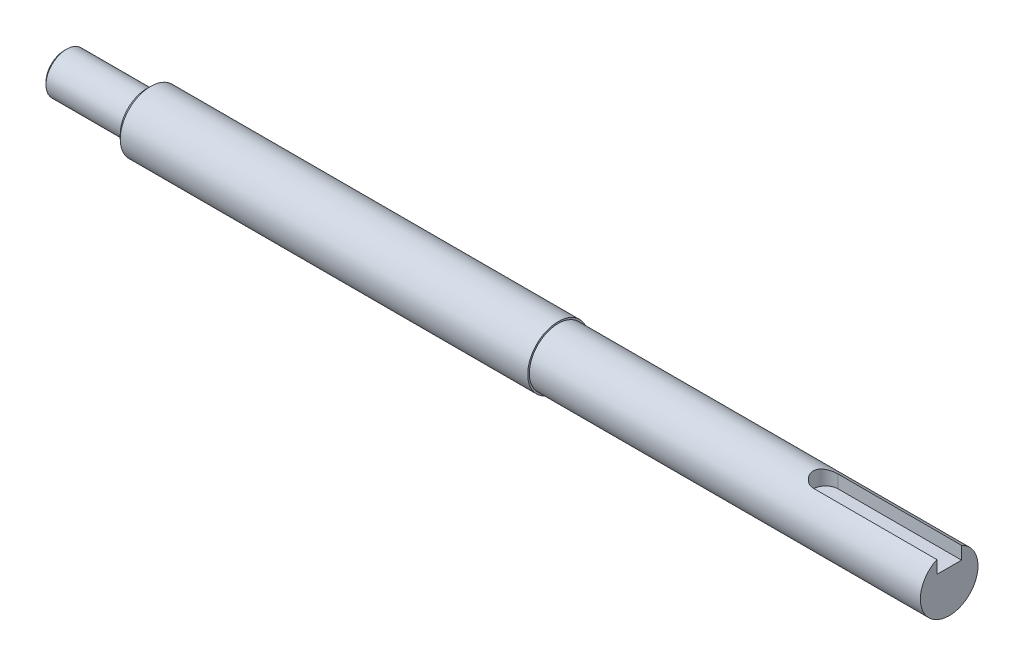
ISO-10303-21;
HEADER;
FILE_DESCRIPTION(('STEP AP214'),'2;1');
FILE_NAME('part.step','',(''),(''),'','','');
FILE_SCHEMA(('AUTOMOTIVE_DESIGN { 1 0 10303 214 1 1 1 1 }'));
ENDSEC;
DATA;
#1=APPLICATION_CONTEXT('core data for automotive mechanical design processes');
#2=APPLICATION_PROTOCOL_DEFINITION('international standard','automotive_design',2000,#1);
#3=PRODUCT_CONTEXT('',#1,'mechanical');
#4=PRODUCT('Part','Part','',(#3));
#5=PRODUCT_RELATED_PRODUCT_CATEGORY('part','',(#4));
#6=PRODUCT_DEFINITION_FORMATION('','',#4);
#7=PRODUCT_DEFINITION_CONTEXT('part definition',#1,'design');
#8=PRODUCT_DEFINITION('design','',#6,#7);
#9=PRODUCT_DEFINITION_SHAPE('','',#8);
#10=(LENGTH_UNIT() NAMED_UNIT(*) SI_UNIT(.MILLI.,.METRE.));
#11=(NAMED_UNIT(*) PLANE_ANGLE_UNIT() SI_UNIT($,.RADIAN.));
#12=(NAMED_UNIT(*) SI_UNIT($,.STERADIAN.) SOLID_ANGLE_UNIT());
#13=UNCERTAINTY_MEASURE_WITH_UNIT(LENGTH_MEASURE(1.E-05),#10,'distance_accuracy_value','');
#14=(GEOMETRIC_REPRESENTATION_CONTEXT(3) GLOBAL_UNCERTAINTY_ASSIGNED_CONTEXT((#13)) GLOBAL_UNIT_ASSIGNED_CONTEXT((#10,
#11,#12)) REPRESENTATION_CONTEXT('',''));
#15=CARTESIAN_POINT('',(0.,0.,0.));
#16=DIRECTION('',(0.,0.,1.));
#17=DIRECTION('',(1.,0.,0.));
#18=AXIS2_PLACEMENT_3D('',#15,#16,#17);
#19=CARTESIAN_POINT('',(215.,0.,0.));
#20=DIRECTION('',(1.,0.,0.));
#21=DIRECTION('',(0.,0.,-1.));
#22=AXIS2_PLACEMENT_3D('',#19,#20,#21);
#23=CYLINDRICAL_SURFACE('',#22,6.99999999999999);
#24=CARTESIAN_POINT('',(120.,0.,0.));
#25=DIRECTION('',(1.,0.,0.));
#26=DIRECTION('',(0.,0.,-1.));
#27=AXIS2_PLACEMENT_3D('',#24,#25,#26);
#28=CIRCLE('',#27,6.99999999999999);
#29=CARTESIAN_POINT('',(120.,0.,-6.99999999999999));
#30=VERTEX_POINT('',#29);
#31=EDGE_CURVE('E139',#30,#30,#28,.T.);
#32=ORIENTED_EDGE('',*,*,#31,.T.);
#33=EDGE_LOOP('',(#32));
#34=FACE_BOUND('',#33,.T.);
#35=CARTESIAN_POINT('',(215.,0.,0.));
#36=DIRECTION('',(1.,0.,0.));
#37=DIRECTION('',(0.,0.,-1.));
#38=AXIS2_PLACEMENT_3D('',#35,#36,#37);
#39=CIRCLE('',#38,6.99999999999999);
#40=CARTESIAN_POINT('',(215.,6.32455532033675,2.99999999999999));
#41=VERTEX_POINT('',#40);
#42=CARTESIAN_POINT('',(215.,6.32455532033674,-3.00000000000001));
#43=VERTEX_POINT('',#42);
#44=EDGE_CURVE('E135',#41,#43,#39,.T.);
#45=ORIENTED_EDGE('',*,*,#44,.F.);
#46=DIRECTION('',(1.,0.,0.));
#47=VECTOR('',#46,1.);
#48=CARTESIAN_POINT('',(215.,6.32455532033675,2.99999999999999));
#49=LINE('',#48,#47);
#50=CARTESIAN_POINT('',(185.,6.32455532033675,2.99999999999999));
#51=VERTEX_POINT('',#50);
#52=EDGE_CURVE('E75',#41,#51,#49,.F.);
#53=ORIENTED_EDGE('',*,*,#52,.T.);
#54=CARTESIAN_POINT('',(185.,6.32455532033675,2.99999999999999));
#55=CARTESIAN_POINT('',(184.919849098455,6.32453705769519,3.00001254306736));
#56=CARTESIAN_POINT('',(184.839708175892,6.32607849540028,2.99678828367235));
#57=CARTESIAN_POINT('',(184.680085813293,6.33214404225042,2.9839643617539));
#58=CARTESIAN_POINT('',(184.600604099698,6.33666684428159,2.97436749314781));
#59=CARTESIAN_POINT('',(184.443215537221,6.34853244046131,2.9489524550049));
#60=CARTESIAN_POINT('',(184.365303296234,6.35586273428948,2.93316185555731));
#61=CARTESIAN_POINT('',(184.211256812614,6.3730877774628,2.89554459420568));
#62=CARTESIAN_POINT('',(184.13512270218,6.38298271682504,2.87371748504272));
#63=CARTESIAN_POINT('',(183.91035282903,6.41603200490111,2.79955128780393));
#64=CARTESIAN_POINT('',(183.76499569635,6.44257971875666,2.73846921792857));
#65=CARTESIAN_POINT('',(183.486515772062,6.50169272050227,2.59499222380164));
#66=CARTESIAN_POINT('',(183.353406788418,6.53426467832252,2.51257363532669));
#67=CARTESIAN_POINT('',(183.094544955766,6.60411405312685,2.32302725293402));
#68=CARTESIAN_POINT('',(182.969694143716,6.64155588231651,2.21472548614638));
#69=CARTESIAN_POINT('',(182.739276817769,6.7155744306841,1.97896856528652));
#70=CARTESIAN_POINT('',(182.633714566743,6.75215095707453,1.85150918860015));
#71=CARTESIAN_POINT('',(182.44008134089,6.8223644642648,1.5737747831145));
#72=CARTESIAN_POINT('',(182.353050641411,6.8557859753075,1.42271495617816));
#73=CARTESIAN_POINT('',(182.206035417155,6.91387431646518,1.10640653485993));
#74=CARTESIAN_POINT('',(182.146038130262,6.93854527642641,0.941164679580412));
#75=CARTESIAN_POINT('',(182.058135397375,6.97517454962191,0.610765713747409));
#76=CARTESIAN_POINT('',(182.028654475699,6.98775425794011,0.446098082630154));
#77=CARTESIAN_POINT('',(181.997517319212,7.001049244749,0.113702417032886));
#78=CARTESIAN_POINT('',(181.995849600784,7.00176941984547,-0.0540243257525655));
#79=CARTESIAN_POINT('',(182.019590365481,6.99162028745114,-0.376269822044588));
#80=CARTESIAN_POINT('',(182.043264269312,6.98149340930556,-0.53094423690181));
#81=CARTESIAN_POINT('',(182.114024875319,6.95182170740074,-0.833874381657529));
#82=CARTESIAN_POINT('',(182.161112887015,6.93227635688086,-0.982129752043266));
#83=CARTESIAN_POINT('',(182.2779063711,6.88526707387883,-1.27075708852243));
#84=CARTESIAN_POINT('',(182.347946982619,6.85768652277446,-1.41097366608797));
#85=CARTESIAN_POINT('',(182.508315636137,6.79727719946514,-1.67803358062501));
#86=CARTESIAN_POINT('',(182.598651221775,6.76444647708388,-1.80487191908105));
#87=CARTESIAN_POINT('',(182.80480558241,6.69393989837268,-2.05154095832147));
#88=CARTESIAN_POINT('',(182.922014102894,6.65608528204453,-2.17016135987782));
#89=CARTESIAN_POINT('',(183.174677964392,6.58158115892304,-2.38661241389783));
#90=CARTESIAN_POINT('',(183.310143261004,6.54493232331543,-2.4844316477271));
#91=CARTESIAN_POINT('',(183.60189993554,6.47564598718051,-2.65993956976187));
#92=CARTESIAN_POINT('',(183.758776418496,6.44320707333587,-2.73674953348503));
#93=CARTESIAN_POINT('',(184.003142898673,6.40212784214385,-2.83088640162987));
#94=CARTESIAN_POINT('',(184.086080592205,6.38970056630823,-2.85874710711773));
#95=CARTESIAN_POINT('',(184.25442301807,6.36780421567578,-2.90719355697351));
#96=CARTESIAN_POINT('',(184.339826634162,6.35833382463913,-2.92778253884331));
#97=CARTESIAN_POINT('',(184.520345779541,6.34202643705266,-2.96296075241436));
#98=CARTESIAN_POINT('',(184.615632745322,6.33551128843582,-2.97682504322622));
#99=CARTESIAN_POINT('',(184.807274020579,6.32675693798107,-2.99535742107445));
#100=CARTESIAN_POINT('',(184.903628174531,6.32451712112742,-3.00002683081742));
#101=CARTESIAN_POINT('',(185.,6.32455532033674,-3.00000000000001));
#102=B_SPLINE_CURVE_WITH_KNOTS('',3,(#54,#55,#56,#57,#58,#59,#60,#61,#62,#63,#64,#65,#66,#67,
#68,#69,#70,#71,#72,#73,#74,#75,#76,#77,#78,#79,#80,#81,#82,#83,#84,#85,#86,#87,#88,#89,#90,#91,
#92,#93,#94,#95,#96,#97,#98,#99,#100,#101),.UNSPECIFIED.,.F.,.F.,(4,2,2,2,2,2,2,2,2,2,2,2,2,2,2,
2,2,2,2,2,2,2,2,4),(0.,0.240356519060135,0.480607729095725,0.719801431096838,0.959012860261086,
1.43637009492775,1.91425904933999,2.42044016106245,2.92673300647695,3.45654397418246,
3.98610456240994,4.48670712132503,4.98710298451016,5.45531455073318,5.92355230634702,
6.39895663828865,6.87453797112704,7.38526003695073,7.89626173993991,8.4261701281025,
8.69096435319374,8.95564053808947,9.24463173513523,9.53358135703768),.UNSPECIFIED.);
#103=CARTESIAN_POINT('',(185.,6.32455532033674,-3.00000000000001));
#104=VERTEX_POINT('',#103);
#105=EDGE_CURVE('E11',#51,#104,#102,.T.);
#106=ORIENTED_EDGE('',*,*,#105,.T.);
#107=DIRECTION('',(1.,0.,0.));
#108=VECTOR('',#107,1.);
#109=CARTESIAN_POINT('',(215.,6.32455532033674,-3.00000000000001));
#110=LINE('',#109,#108);
#111=EDGE_CURVE('E100',#104,#43,#110,.T.);
#112=ORIENTED_EDGE('',*,*,#111,.T.);
#113=EDGE_LOOP('',(#45,#53,#106,#112));
#114=FACE_BOUND('',#113,.T.);
#115=ADVANCED_FACE('F45',(#34,#114),#23,.T.);
#116=CARTESIAN_POINT('',(215.,0.,-6.99999999999999));
#117=DIRECTION('',(1.,0.,0.));
#118=DIRECTION('',(0.,0.,-1.));
#119=AXIS2_PLACEMENT_3D('',#116,#117,#118);
#120=PLANE('',#119);
#121=DIRECTION('',(0.,0.,1.));
#122=VECTOR('',#121,1.);
#123=CARTESIAN_POINT('',(215.,3.2,-6.99999999999999));
#124=LINE('',#123,#122);
#125=CARTESIAN_POINT('',(215.,3.2,-3.00000000000001));
#126=VERTEX_POINT('',#125);
#127=CARTESIAN_POINT('',(215.,3.2,2.99999999999999));
#128=VERTEX_POINT('',#127);
#129=EDGE_CURVE('E155',#126,#128,#124,.T.);
#130=ORIENTED_EDGE('',*,*,#129,.T.);
#131=DIRECTION('',(0.,1.,0.));
#132=VECTOR('',#131,1.);
#133=CARTESIAN_POINT('',(215.,0.,2.99999999999999));
#134=LINE('',#133,#132);
#135=EDGE_CURVE('E61',#128,#41,#134,.T.);
#136=ORIENTED_EDGE('',*,*,#135,.T.);
#137=ORIENTED_EDGE('',*,*,#44,.T.);
#138=DIRECTION('',(0.,-1.,0.));
#139=VECTOR('',#138,1.);
#140=CARTESIAN_POINT('',(215.,0.,-3.00000000000001));
#141=LINE('',#140,#139);
#142=EDGE_CURVE('E158',#43,#126,#141,.T.);
#143=ORIENTED_EDGE('',*,*,#142,.T.);
#144=EDGE_LOOP('',(#130,#136,#137,#143));
#145=FACE_BOUND('',#144,.T.);
#146=ADVANCED_FACE('F164',(#145),#120,.T.);
#147=CARTESIAN_POINT('',(20.,0.,-7.));
#148=DIRECTION('',(-1.,0.,0.));
#149=DIRECTION('',(0.,0.,1.));
#150=AXIS2_PLACEMENT_3D('',#147,#148,#149);
#151=PLANE('',#150);
#152=CARTESIAN_POINT('',(20.,0.,0.));
#153=DIRECTION('',(-1.,0.,0.));
#154=DIRECTION('',(0.,0.,1.));
#155=AXIS2_PLACEMENT_3D('',#152,#153,#154);
#156=CIRCLE('',#155,6.39999999999997);
#157=CARTESIAN_POINT('',(20.,0.,6.39999999999997));
#158=VERTEX_POINT('',#157);
#159=EDGE_CURVE('E151',#158,#158,#156,.T.);
#160=ORIENTED_EDGE('',*,*,#159,.T.);
#161=EDGE_LOOP('',(#160));
#162=FACE_BOUND('',#161,.T.);
#163=CARTESIAN_POINT('',(20.,0.,0.));
#164=DIRECTION('',(1.,0.,0.));
#165=DIRECTION('',(0.,0.,-1.));
#166=AXIS2_PLACEMENT_3D('',#163,#164,#165);
#167=CIRCLE('',#166,5.);
#168=CARTESIAN_POINT('',(20.,0.,-5.));
#169=VERTEX_POINT('',#168);
#170=EDGE_CURVE('E131',#169,#169,#167,.T.);
#171=ORIENTED_EDGE('',*,*,#170,.T.);
#172=EDGE_LOOP('',(#171));
#173=FACE_BOUND('',#172,.T.);
#174=ADVANCED_FACE('F181',(#162,#173),#151,.T.);
#175=CARTESIAN_POINT('',(215.,0.,0.));
#176=DIRECTION('',(1.,0.,0.));
#177=DIRECTION('',(0.,0.,-1.));
#178=AXIS2_PLACEMENT_3D('',#175,#176,#177);
#179=CYLINDRICAL_SURFACE('',#178,7.39999999999998);
#180=CARTESIAN_POINT('',(21.,0.,0.));
#181=DIRECTION('',(-1.,0.,0.));
#182=DIRECTION('',(0.,0.,1.));
#183=AXIS2_PLACEMENT_3D('',#180,#181,#182);
#184=CIRCLE('',#183,7.39999999999998);
#185=CARTESIAN_POINT('',(21.,0.,7.39999999999998));
#186=VERTEX_POINT('',#185);
#187=EDGE_CURVE('E147',#186,#186,#184,.F.);
#188=ORIENTED_EDGE('',*,*,#187,.T.);
#189=EDGE_LOOP('',(#188));
#190=FACE_BOUND('',#189,.T.);
#191=CARTESIAN_POINT('',(120.,0.,0.));
#192=DIRECTION('',(1.,0.,0.));
#193=DIRECTION('',(0.,0.,-1.));
#194=AXIS2_PLACEMENT_3D('',#191,#192,#193);
#195=CIRCLE('',#194,7.39999999999998);
#196=CARTESIAN_POINT('',(120.,0.,-7.39999999999998));
#197=VERTEX_POINT('',#196);
#198=EDGE_CURVE('E143',#197,#197,#195,.T.);
#199=ORIENTED_EDGE('',*,*,#198,.F.);
#200=EDGE_LOOP('',(#199));
#201=FACE_BOUND('',#200,.T.);
#202=ADVANCED_FACE('F190',(#190,#201),#179,.T.);
#203=CARTESIAN_POINT('',(120.,0.,-7.39999999999998));
#204=DIRECTION('',(1.,0.,0.));
#205=DIRECTION('',(0.,0.,-1.));
#206=AXIS2_PLACEMENT_3D('',#203,#204,#205);
#207=PLANE('',#206);
#208=ORIENTED_EDGE('',*,*,#198,.T.);
#209=EDGE_LOOP('',(#208));
#210=FACE_BOUND('',#209,.T.);
#211=ORIENTED_EDGE('',*,*,#31,.F.);
#212=EDGE_LOOP('',(#211));
#213=FACE_BOUND('',#212,.T.);
#214=ADVANCED_FACE('F186',(#210,#213),#207,.T.);
#215=CARTESIAN_POINT('',(0.,0.,0.));
#216=DIRECTION('',(1.,0.,0.));
#217=DIRECTION('',(0.,0.,-1.));
#218=AXIS2_PLACEMENT_3D('',#215,#216,#217);
#219=CYLINDRICAL_SURFACE('',#218,5.);
#220=ORIENTED_EDGE('',*,*,#170,.F.);
#221=EDGE_LOOP('',(#220));
#222=FACE_BOUND('',#221,.T.);
#223=CARTESIAN_POINT('',(0.554499999999998,0.,0.));
#224=DIRECTION('',(1.,0.,0.));
#225=DIRECTION('',(0.,0.,-1.));
#226=AXIS2_PLACEMENT_3D('',#223,#224,#225);
#227=CIRCLE('',#226,5.);
#228=CARTESIAN_POINT('',(0.554499999999998,0.,-5.));
#229=VERTEX_POINT('',#228);
#230=EDGE_CURVE('E123',#229,#229,#227,.T.);
#231=ORIENTED_EDGE('',*,*,#230,.T.);
#232=EDGE_LOOP('',(#231));
#233=FACE_BOUND('',#232,.T.);
#234=ADVANCED_FACE('F189',(#222,#233),#219,.T.);
#235=CARTESIAN_POINT('',(0.,0.,0.));
#236=DIRECTION('',(1.,0.,0.));
#237=DIRECTION('',(0.,0.,-1.));
#238=AXIS2_PLACEMENT_3D('',#235,#236,#237);
#239=CONICAL_SURFACE('',#238,4.4455,0.785398163397449);
#240=ORIENTED_EDGE('',*,*,#230,.F.);
#241=EDGE_LOOP('',(#240));
#242=FACE_BOUND('',#241,.T.);
#243=CARTESIAN_POINT('',(0.,0.,0.));
#244=DIRECTION('',(1.,0.,0.));
#245=DIRECTION('',(0.,0.,-1.));
#246=AXIS2_PLACEMENT_3D('',#243,#244,#245);
#247=CIRCLE('',#246,4.4455);
#248=CARTESIAN_POINT('',(0.,0.,-4.4455));
#249=VERTEX_POINT('',#248);
#250=EDGE_CURVE('E127',#249,#249,#247,.T.);
#251=ORIENTED_EDGE('',*,*,#250,.T.);
#252=EDGE_LOOP('',(#251));
#253=FACE_BOUND('',#252,.T.);
#254=ADVANCED_FACE('F199',(#242,#253),#239,.T.);
#255=CARTESIAN_POINT('',(0.,0.,0.));
#256=DIRECTION('',(-1.,0.,0.));
#257=DIRECTION('',(0.,0.,1.));
#258=AXIS2_PLACEMENT_3D('',#255,#256,#257);
#259=PLANE('',#258);
#260=ORIENTED_EDGE('',*,*,#250,.F.);
#261=EDGE_LOOP('',(#260));
#262=FACE_BOUND('',#261,.T.);
#263=ADVANCED_FACE('F197',(#262),#259,.T.);
#264=CARTESIAN_POINT('',(21.,0.,0.));
#265=DIRECTION('',(1.,0.,0.));
#266=DIRECTION('',(0.,0.,-1.));
#267=AXIS2_PLACEMENT_3D('',#264,#265,#266);
#268=CONICAL_SURFACE('',#267,7.39999999999998,0.785398163397455);
#269=ORIENTED_EDGE('',*,*,#159,.F.);
#270=EDGE_LOOP('',(#269));
#271=FACE_BOUND('',#270,.T.);
#272=ORIENTED_EDGE('',*,*,#187,.F.);
#273=EDGE_LOOP('',(#272));
#274=FACE_BOUND('',#273,.T.);
#275=ADVANCED_FACE('F48',(#271,#274),#268,.T.);
#276=CARTESIAN_POINT('',(185.,13.2,0.));
#277=DIRECTION('',(0.,-1.,0.));
#278=DIRECTION('',(0.,0.,-1.));
#279=AXIS2_PLACEMENT_3D('',#276,#277,#278);
#280=CYLINDRICAL_SURFACE('',#279,3.);
#281=DIRECTION('',(0.,-1.,0.));
#282=VECTOR('',#281,1.);
#283=CARTESIAN_POINT('',(185.,13.2,2.99999999999999));
#284=LINE('',#283,#282);
#285=CARTESIAN_POINT('',(185.,3.2,2.99999999999999));
#286=VERTEX_POINT('',#285);
#287=EDGE_CURVE('E95',#51,#286,#284,.T.);
#288=ORIENTED_EDGE('',*,*,#287,.T.);
#289=CARTESIAN_POINT('',(185.,3.2,0.));
#290=DIRECTION('',(0.,1.,0.));
#291=DIRECTION('',(0.,0.,1.));
#292=AXIS2_PLACEMENT_3D('',#289,#290,#291);
#293=CIRCLE('',#292,3.);
#294=CARTESIAN_POINT('',(185.,3.2,-3.00000000000001));
#295=VERTEX_POINT('',#294);
#296=EDGE_CURVE('E98',#295,#286,#293,.T.);
#297=ORIENTED_EDGE('',*,*,#296,.F.);
#298=DIRECTION('',(0.,-1.,0.));
#299=VECTOR('',#298,1.);
#300=CARTESIAN_POINT('',(185.,13.2,-3.00000000000001));
#301=LINE('',#300,#299);
#302=EDGE_CURVE('E101',#104,#295,#301,.T.);
#303=ORIENTED_EDGE('',*,*,#302,.F.);
#304=ORIENTED_EDGE('',*,*,#105,.F.);
#305=EDGE_LOOP('',(#288,#297,#303,#304));
#306=FACE_BOUND('',#305,.T.);
#307=ADVANCED_FACE('F96',(#306),#280,.F.);
#308=CARTESIAN_POINT('',(245.,13.2,2.99999999999999));
#309=DIRECTION('',(0.,0.,-1.));
#310=DIRECTION('',(-1.,0.,0.));
#311=AXIS2_PLACEMENT_3D('',#308,#309,#310);
#312=PLANE('',#311);
#313=ORIENTED_EDGE('',*,*,#135,.F.);
#314=DIRECTION('',(1.,0.,0.));
#315=VECTOR('',#314,1.);
#316=CARTESIAN_POINT('',(245.,3.2,2.99999999999999));
#317=LINE('',#316,#315);
#318=EDGE_CURVE('E68',#286,#128,#317,.T.);
#319=ORIENTED_EDGE('',*,*,#318,.F.);
#320=ORIENTED_EDGE('',*,*,#287,.F.);
#321=ORIENTED_EDGE('',*,*,#52,.F.);
#322=EDGE_LOOP('',(#313,#319,#320,#321));
#323=FACE_BOUND('',#322,.T.);
#324=ADVANCED_FACE('F103',(#323),#312,.T.);
#325=CARTESIAN_POINT('',(245.,13.2,-3.00000000000002));
#326=DIRECTION('',(0.,0.,1.));
#327=DIRECTION('',(1.,0.,0.));
#328=AXIS2_PLACEMENT_3D('',#325,#326,#327);
#329=PLANE('',#328);
#330=ORIENTED_EDGE('',*,*,#302,.T.);
#331=DIRECTION('',(-1.,0.,0.));
#332=VECTOR('',#331,1.);
#333=CARTESIAN_POINT('',(245.,3.2,-3.00000000000002));
#334=LINE('',#333,#332);
#335=EDGE_CURVE('E106',#126,#295,#334,.T.);
#336=ORIENTED_EDGE('',*,*,#335,.F.);
#337=ORIENTED_EDGE('',*,*,#142,.F.);
#338=ORIENTED_EDGE('',*,*,#111,.F.);
#339=EDGE_LOOP('',(#330,#336,#337,#338));
#340=FACE_BOUND('',#339,.T.);
#341=ADVANCED_FACE('F167',(#340),#329,.T.);
#342=CARTESIAN_POINT('',(185.,3.2,0.));
#343=DIRECTION('',(0.,1.,0.));
#344=DIRECTION('',(0.,0.,1.));
#345=AXIS2_PLACEMENT_3D('',#342,#343,#344);
#346=PLANE('',#345);
#347=ORIENTED_EDGE('',*,*,#335,.T.);
#348=ORIENTED_EDGE('',*,*,#296,.T.);
#349=ORIENTED_EDGE('',*,*,#318,.T.);
#350=ORIENTED_EDGE('',*,*,#129,.F.);
#351=EDGE_LOOP('',(#347,#348,#349,#350));
#352=FACE_BOUND('',#351,.T.);
#353=ADVANCED_FACE('F109',(#352),#346,.T.);
#354=CLOSED_SHELL('',(#115,#146,#174,#202,#214,#234,#254,#263,#275,#307,#324,#341,#353));
#355=MANIFOLD_SOLID_BREP('B2',#354);
#356=ADVANCED_BREP_SHAPE_REPRESENTATION('',(#18,#355),#14);
#357=SHAPE_DEFINITION_REPRESENTATION(#9,#356);
ENDSEC;
END-ISO-10303-21;
